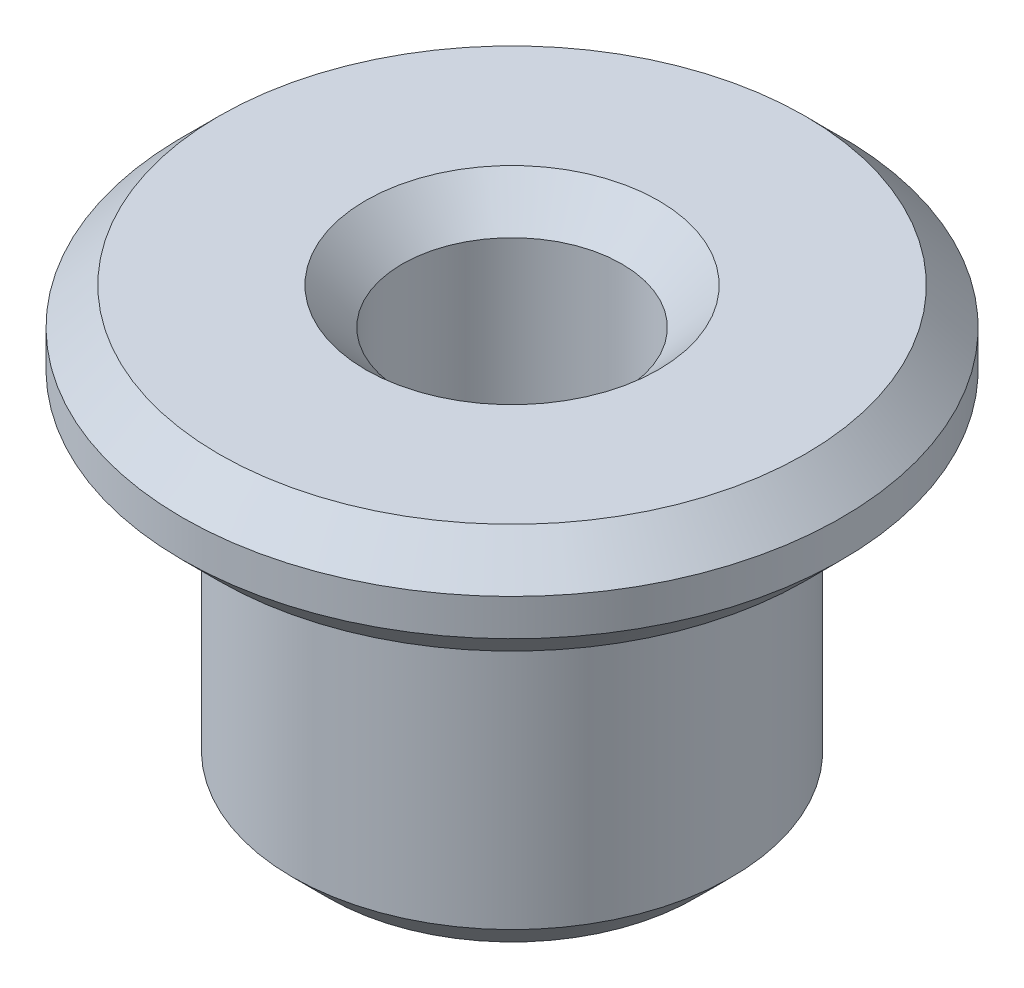
ISO-10303-21;
HEADER;
FILE_DESCRIPTION(('STEP AP214'),'2;1');
FILE_NAME('part.step','',(''),(''),'','','');
FILE_SCHEMA(('AUTOMOTIVE_DESIGN { 1 0 10303 214 1 1 1 1 }'));
ENDSEC;
DATA;
#1=APPLICATION_CONTEXT('core data for automotive mechanical design processes');
#2=APPLICATION_PROTOCOL_DEFINITION('international standard','automotive_design',2000,#1);
#3=PRODUCT_CONTEXT('',#1,'mechanical');
#4=PRODUCT('Part','Part','',(#3));
#5=PRODUCT_RELATED_PRODUCT_CATEGORY('part','',(#4));
#6=PRODUCT_DEFINITION_FORMATION('','',#4);
#7=PRODUCT_DEFINITION_CONTEXT('part definition',#1,'design');
#8=PRODUCT_DEFINITION('design','',#6,#7);
#9=PRODUCT_DEFINITION_SHAPE('','',#8);
#10=(LENGTH_UNIT() NAMED_UNIT(*) SI_UNIT(.MILLI.,.METRE.));
#11=(NAMED_UNIT(*) PLANE_ANGLE_UNIT() SI_UNIT($,.RADIAN.));
#12=(NAMED_UNIT(*) SI_UNIT($,.STERADIAN.) SOLID_ANGLE_UNIT());
#13=UNCERTAINTY_MEASURE_WITH_UNIT(LENGTH_MEASURE(1.E-05),#10,'distance_accuracy_value','');
#14=(GEOMETRIC_REPRESENTATION_CONTEXT(3) GLOBAL_UNCERTAINTY_ASSIGNED_CONTEXT((#13)) GLOBAL_UNIT_ASSIGNED_CONTEXT((#10,
#11,#12)) REPRESENTATION_CONTEXT('',''));
#15=CARTESIAN_POINT('',(0.,0.,0.));
#16=DIRECTION('',(0.,0.,1.));
#17=DIRECTION('',(1.,0.,0.));
#18=AXIS2_PLACEMENT_3D('',#15,#16,#17);
#19=CARTESIAN_POINT('',(0.,0.,0.));
#20=DIRECTION('',(0.,1.,0.));
#21=DIRECTION('',(0.,0.,1.));
#22=AXIS2_PLACEMENT_3D('',#19,#20,#21);
#23=CONICAL_SURFACE('',#22,2.00000000000001,0.785398163397448);
#24=CARTESIAN_POINT('',(0.,-0.500000000000001,0.));
#25=DIRECTION('',(0.,1.,0.));
#26=DIRECTION('',(0.,0.,1.));
#27=AXIS2_PLACEMENT_3D('',#24,#25,#26);
#28=CIRCLE('',#27,1.50000000000001);
#29=CARTESIAN_POINT('',(0.,-0.500000000000001,1.50000000000001));
#30=VERTEX_POINT('',#29);
#31=EDGE_CURVE('E10',#30,#30,#28,.T.);
#32=ORIENTED_EDGE('',*,*,#31,.F.);
#33=EDGE_LOOP('',(#32));
#34=FACE_BOUND('',#33,.T.);
#35=CARTESIAN_POINT('',(0.,0.,0.));
#36=DIRECTION('',(0.,1.,0.));
#37=DIRECTION('',(0.,0.,1.));
#38=AXIS2_PLACEMENT_3D('',#35,#36,#37);
#39=CIRCLE('',#38,2.00000000000001);
#40=CARTESIAN_POINT('',(0.,0.,2.00000000000001));
#41=VERTEX_POINT('',#40);
#42=EDGE_CURVE('E77',#41,#41,#39,.T.);
#43=ORIENTED_EDGE('',*,*,#42,.T.);
#44=EDGE_LOOP('',(#43));
#45=FACE_BOUND('',#44,.T.);
#46=ADVANCED_FACE('F37',(#34,#45),#23,.F.);
#47=CARTESIAN_POINT('',(0.,0.,0.));
#48=DIRECTION('',(0.,1.,0.));
#49=DIRECTION('',(0.,0.,1.));
#50=AXIS2_PLACEMENT_3D('',#47,#48,#49);
#51=CYLINDRICAL_SURFACE('',#50,1.5);
#52=CARTESIAN_POINT('',(0.,-5.5,0.));
#53=DIRECTION('',(0.,1.,0.));
#54=DIRECTION('',(0.,0.,1.));
#55=AXIS2_PLACEMENT_3D('',#52,#53,#54);
#56=CIRCLE('',#55,1.5);
#57=CARTESIAN_POINT('',(0.,-5.5,1.5));
#58=VERTEX_POINT('',#57);
#59=EDGE_CURVE('E43',#58,#58,#56,.T.);
#60=ORIENTED_EDGE('',*,*,#59,.F.);
#61=EDGE_LOOP('',(#60));
#62=FACE_BOUND('',#61,.T.);
#63=ORIENTED_EDGE('',*,*,#31,.T.);
#64=EDGE_LOOP('',(#63));
#65=FACE_BOUND('',#64,.T.);
#66=ADVANCED_FACE('F138',(#62,#65),#51,.F.);
#67=CARTESIAN_POINT('',(0.,-5.5,0.));
#68=DIRECTION('',(0.,-1.,0.));
#69=DIRECTION('',(0.,0.,-1.));
#70=AXIS2_PLACEMENT_3D('',#67,#68,#69);
#71=CONICAL_SURFACE('',#70,1.5,0.785398163397447);
#72=CARTESIAN_POINT('',(0.,-6.,0.));
#73=DIRECTION('',(0.,1.,0.));
#74=DIRECTION('',(0.,0.,1.));
#75=AXIS2_PLACEMENT_3D('',#72,#73,#74);
#76=CIRCLE('',#75,2.);
#77=CARTESIAN_POINT('',(0.,-6.,2.));
#78=VERTEX_POINT('',#77);
#79=EDGE_CURVE('E47',#78,#78,#76,.T.);
#80=ORIENTED_EDGE('',*,*,#79,.F.);
#81=EDGE_LOOP('',(#80));
#82=FACE_BOUND('',#81,.T.);
#83=ORIENTED_EDGE('',*,*,#59,.T.);
#84=EDGE_LOOP('',(#83));
#85=FACE_BOUND('',#84,.T.);
#86=ADVANCED_FACE('F133',(#82,#85),#71,.F.);
#87=CARTESIAN_POINT('',(2.5,-6.,0.));
#88=DIRECTION('',(0.,1.,0.));
#89=DIRECTION('',(0.,0.,1.));
#90=AXIS2_PLACEMENT_3D('',#87,#88,#89);
#91=PLANE('',#90);
#92=CARTESIAN_POINT('',(0.,-6.,0.));
#93=DIRECTION('',(0.,1.,0.));
#94=DIRECTION('',(0.,0.,1.));
#95=AXIS2_PLACEMENT_3D('',#92,#93,#94);
#96=CIRCLE('',#95,2.5);
#97=CARTESIAN_POINT('',(0.,-6.,2.5));
#98=VERTEX_POINT('',#97);
#99=EDGE_CURVE('E51',#98,#98,#96,.T.);
#100=ORIENTED_EDGE('',*,*,#99,.F.);
#101=EDGE_LOOP('',(#100));
#102=FACE_BOUND('',#101,.T.);
#103=ORIENTED_EDGE('',*,*,#79,.T.);
#104=EDGE_LOOP('',(#103));
#105=FACE_BOUND('',#104,.T.);
#106=ADVANCED_FACE('F127',(#102,#105),#91,.F.);
#107=CARTESIAN_POINT('',(0.,-6.,0.));
#108=DIRECTION('',(0.,1.,0.));
#109=DIRECTION('',(0.,0.,1.));
#110=AXIS2_PLACEMENT_3D('',#107,#108,#109);
#111=CONICAL_SURFACE('',#110,2.5,0.785398163397445);
#112=CARTESIAN_POINT('',(0.,-5.5,0.));
#113=DIRECTION('',(0.,1.,0.));
#114=DIRECTION('',(0.,0.,1.));
#115=AXIS2_PLACEMENT_3D('',#112,#113,#114);
#116=CIRCLE('',#115,3.);
#117=CARTESIAN_POINT('',(0.,-5.5,3.));
#118=VERTEX_POINT('',#117);
#119=EDGE_CURVE('E56',#118,#118,#116,.T.);
#120=ORIENTED_EDGE('',*,*,#119,.F.);
#121=EDGE_LOOP('',(#120));
#122=FACE_BOUND('',#121,.T.);
#123=ORIENTED_EDGE('',*,*,#99,.T.);
#124=EDGE_LOOP('',(#123));
#125=FACE_BOUND('',#124,.T.);
#126=ADVANCED_FACE('F121',(#122,#125),#111,.T.);
#127=CARTESIAN_POINT('',(0.,0.,0.));
#128=DIRECTION('',(0.,1.,0.));
#129=DIRECTION('',(0.,0.,1.));
#130=AXIS2_PLACEMENT_3D('',#127,#128,#129);
#131=CYLINDRICAL_SURFACE('',#130,3.);
#132=CARTESIAN_POINT('',(0.,-2.,0.));
#133=DIRECTION('',(0.,1.,0.));
#134=DIRECTION('',(0.,0.,1.));
#135=AXIS2_PLACEMENT_3D('',#132,#133,#134);
#136=CIRCLE('',#135,3.);
#137=CARTESIAN_POINT('',(0.,-2.,3.));
#138=VERTEX_POINT('',#137);
#139=EDGE_CURVE('E59',#138,#138,#136,.T.);
#140=ORIENTED_EDGE('',*,*,#139,.F.);
#141=EDGE_LOOP('',(#140));
#142=FACE_BOUND('',#141,.T.);
#143=ORIENTED_EDGE('',*,*,#119,.T.);
#144=EDGE_LOOP('',(#143));
#145=FACE_BOUND('',#144,.T.);
#146=ADVANCED_FACE('F115',(#142,#145),#131,.T.);
#147=CARTESIAN_POINT('',(0.,-2.,0.));
#148=DIRECTION('',(0.,1.,0.));
#149=DIRECTION('',(0.,0.,1.));
#150=AXIS2_PLACEMENT_3D('',#147,#148,#149);
#151=TOROIDAL_SURFACE('',#150,3.5,0.499999999999999);
#152=CARTESIAN_POINT('',(0.,-1.5,0.));
#153=DIRECTION('',(0.,1.,0.));
#154=DIRECTION('',(0.,0.,1.));
#155=AXIS2_PLACEMENT_3D('',#152,#153,#154);
#156=CIRCLE('',#155,3.5);
#157=CARTESIAN_POINT('',(0.,-1.5,3.5));
#158=VERTEX_POINT('',#157);
#159=EDGE_CURVE('E62',#158,#158,#156,.T.);
#160=ORIENTED_EDGE('',*,*,#159,.F.);
#161=EDGE_LOOP('',(#160));
#162=FACE_BOUND('',#161,.T.);
#163=ORIENTED_EDGE('',*,*,#139,.T.);
#164=EDGE_LOOP('',(#163));
#165=FACE_BOUND('',#164,.T.);
#166=ADVANCED_FACE('F109',(#162,#165),#151,.F.);
#167=CARTESIAN_POINT('',(4.,-1.5,0.));
#168=DIRECTION('',(0.,1.,0.));
#169=DIRECTION('',(0.,0.,1.));
#170=AXIS2_PLACEMENT_3D('',#167,#168,#169);
#171=PLANE('',#170);
#172=CARTESIAN_POINT('',(0.,-1.5,0.));
#173=DIRECTION('',(0.,1.,0.));
#174=DIRECTION('',(0.,0.,1.));
#175=AXIS2_PLACEMENT_3D('',#172,#173,#174);
#176=CIRCLE('',#175,4.);
#177=CARTESIAN_POINT('',(0.,-1.5,4.));
#178=VERTEX_POINT('',#177);
#179=EDGE_CURVE('E65',#178,#178,#176,.T.);
#180=ORIENTED_EDGE('',*,*,#179,.F.);
#181=EDGE_LOOP('',(#180));
#182=FACE_BOUND('',#181,.T.);
#183=ORIENTED_EDGE('',*,*,#159,.T.);
#184=EDGE_LOOP('',(#183));
#185=FACE_BOUND('',#184,.T.);
#186=ADVANCED_FACE('F103',(#182,#185),#171,.F.);
#187=CARTESIAN_POINT('',(0.,-1.5,0.));
#188=DIRECTION('',(0.,1.,0.));
#189=DIRECTION('',(0.,0.,1.));
#190=AXIS2_PLACEMENT_3D('',#187,#188,#189);
#191=CONICAL_SURFACE('',#190,4.,0.785398163397448);
#192=CARTESIAN_POINT('',(0.,-0.999999999999999,0.));
#193=DIRECTION('',(0.,1.,0.));
#194=DIRECTION('',(0.,0.,1.));
#195=AXIS2_PLACEMENT_3D('',#192,#193,#194);
#196=CIRCLE('',#195,4.5);
#197=CARTESIAN_POINT('',(0.,-0.999999999999999,4.5));
#198=VERTEX_POINT('',#197);
#199=EDGE_CURVE('E68',#198,#198,#196,.T.);
#200=ORIENTED_EDGE('',*,*,#199,.F.);
#201=EDGE_LOOP('',(#200));
#202=FACE_BOUND('',#201,.T.);
#203=ORIENTED_EDGE('',*,*,#179,.T.);
#204=EDGE_LOOP('',(#203));
#205=FACE_BOUND('',#204,.T.);
#206=ADVANCED_FACE('F97',(#202,#205),#191,.T.);
#207=CARTESIAN_POINT('',(0.,0.,0.));
#208=DIRECTION('',(0.,1.,0.));
#209=DIRECTION('',(0.,0.,1.));
#210=AXIS2_PLACEMENT_3D('',#207,#208,#209);
#211=CYLINDRICAL_SURFACE('',#210,4.5);
#212=CARTESIAN_POINT('',(0.,-0.499999999999998,0.));
#213=DIRECTION('',(0.,1.,0.));
#214=DIRECTION('',(0.,0.,1.));
#215=AXIS2_PLACEMENT_3D('',#212,#213,#214);
#216=CIRCLE('',#215,4.5);
#217=CARTESIAN_POINT('',(0.,-0.499999999999998,4.5));
#218=VERTEX_POINT('',#217);
#219=EDGE_CURVE('E71',#218,#218,#216,.T.);
#220=ORIENTED_EDGE('',*,*,#219,.F.);
#221=EDGE_LOOP('',(#220));
#222=FACE_BOUND('',#221,.T.);
#223=ORIENTED_EDGE('',*,*,#199,.T.);
#224=EDGE_LOOP('',(#223));
#225=FACE_BOUND('',#224,.T.);
#226=ADVANCED_FACE('F91',(#222,#225),#211,.T.);
#227=CARTESIAN_POINT('',(0.,-0.499999999999998,0.));
#228=DIRECTION('',(0.,-1.,0.));
#229=DIRECTION('',(0.,0.,-1.));
#230=AXIS2_PLACEMENT_3D('',#227,#228,#229);
#231=CONICAL_SURFACE('',#230,4.5,0.78539816339745);
#232=CARTESIAN_POINT('',(0.,0.,0.));
#233=DIRECTION('',(0.,1.,0.));
#234=DIRECTION('',(0.,0.,1.));
#235=AXIS2_PLACEMENT_3D('',#232,#233,#234);
#236=CIRCLE('',#235,4.);
#237=CARTESIAN_POINT('',(0.,0.,4.));
#238=VERTEX_POINT('',#237);
#239=EDGE_CURVE('E74',#238,#238,#236,.T.);
#240=ORIENTED_EDGE('',*,*,#239,.F.);
#241=EDGE_LOOP('',(#240));
#242=FACE_BOUND('',#241,.T.);
#243=ORIENTED_EDGE('',*,*,#219,.T.);
#244=EDGE_LOOP('',(#243));
#245=FACE_BOUND('',#244,.T.);
#246=ADVANCED_FACE('F85',(#242,#245),#231,.T.);
#247=CARTESIAN_POINT('',(2.00000000000001,0.,0.));
#248=DIRECTION('',(0.,-1.,0.));
#249=DIRECTION('',(0.,0.,-1.));
#250=AXIS2_PLACEMENT_3D('',#247,#248,#249);
#251=PLANE('',#250);
#252=ORIENTED_EDGE('',*,*,#42,.F.);
#253=EDGE_LOOP('',(#252));
#254=FACE_BOUND('',#253,.T.);
#255=ORIENTED_EDGE('',*,*,#239,.T.);
#256=EDGE_LOOP('',(#255));
#257=FACE_BOUND('',#256,.T.);
#258=ADVANCED_FACE('F82',(#254,#257),#251,.F.);
#259=CLOSED_SHELL('',(#46,#66,#86,#106,#126,#146,#166,#186,#206,#226,#246,#258));
#260=MANIFOLD_SOLID_BREP('B2',#259);
#261=ADVANCED_BREP_SHAPE_REPRESENTATION('',(#18,#260),#14);
#262=SHAPE_DEFINITION_REPRESENTATION(#9,#261);
ENDSEC;
END-ISO-10303-21;
